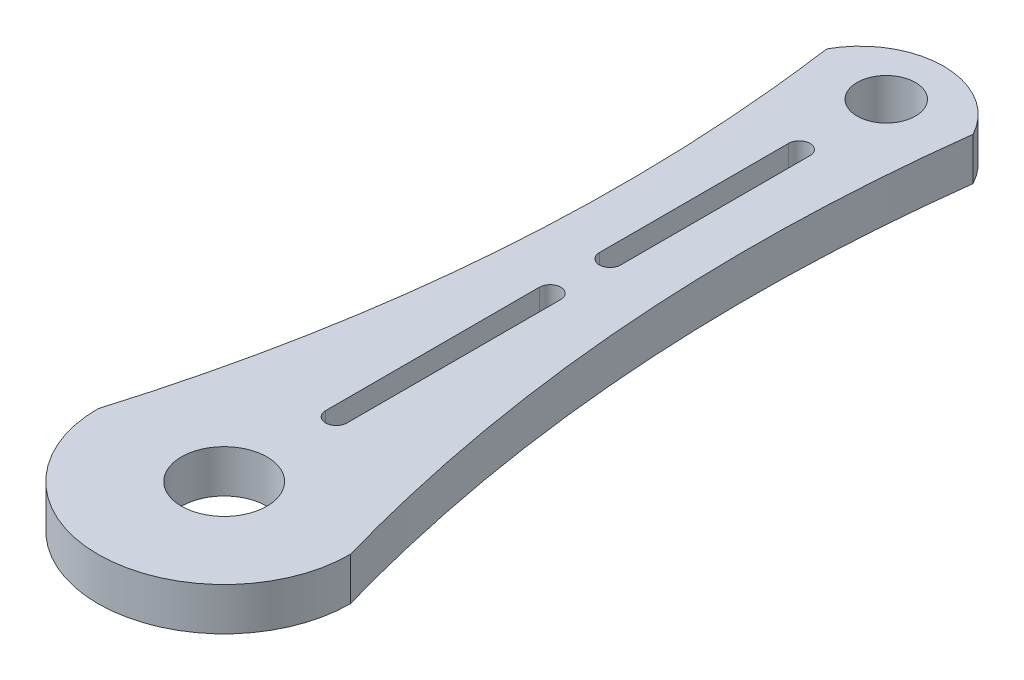
ISO-10303-21;
HEADER;
FILE_DESCRIPTION(('STEP AP214'),'2;1');
FILE_NAME('part.step','',(''),(''),'','','');
FILE_SCHEMA(('AUTOMOTIVE_DESIGN { 1 0 10303 214 1 1 1 1 }'));
ENDSEC;
DATA;
#1=APPLICATION_CONTEXT('core data for automotive mechanical design processes');
#2=APPLICATION_PROTOCOL_DEFINITION('international standard','automotive_design',2000,#1);
#3=PRODUCT_CONTEXT('',#1,'mechanical');
#4=PRODUCT('Part','Part','',(#3));
#5=PRODUCT_RELATED_PRODUCT_CATEGORY('part','',(#4));
#6=PRODUCT_DEFINITION_FORMATION('','',#4);
#7=PRODUCT_DEFINITION_CONTEXT('part definition',#1,'design');
#8=PRODUCT_DEFINITION('design','',#6,#7);
#9=PRODUCT_DEFINITION_SHAPE('','',#8);
#10=(LENGTH_UNIT() NAMED_UNIT(*) SI_UNIT(.MILLI.,.METRE.));
#11=(NAMED_UNIT(*) PLANE_ANGLE_UNIT() SI_UNIT($,.RADIAN.));
#12=(NAMED_UNIT(*) SI_UNIT($,.STERADIAN.) SOLID_ANGLE_UNIT());
#13=UNCERTAINTY_MEASURE_WITH_UNIT(LENGTH_MEASURE(1.E-05),#10,'distance_accuracy_value','');
#14=(GEOMETRIC_REPRESENTATION_CONTEXT(3) GLOBAL_UNCERTAINTY_ASSIGNED_CONTEXT((#13)) GLOBAL_UNIT_ASSIGNED_CONTEXT((#10,
#11,#12)) REPRESENTATION_CONTEXT('',''));
#15=CARTESIAN_POINT('',(0.,0.,0.));
#16=DIRECTION('',(0.,0.,1.));
#17=DIRECTION('',(1.,0.,0.));
#18=AXIS2_PLACEMENT_3D('',#15,#16,#17);
#19=CARTESIAN_POINT('',(-0.0131866120266083,10.,-148.700879107468));
#20=DIRECTION('',(0.,-1.,0.));
#21=DIRECTION('',(0.,0.,-1.));
#22=AXIS2_PLACEMENT_3D('',#19,#20,#21);
#23=CYLINDRICAL_SURFACE('',#22,19.5300694087633);
#24=CARTESIAN_POINT('',(-0.0131866120266083,0.,-148.700879107468));
#25=DIRECTION('',(0.,1.,0.));
#26=DIRECTION('',(0.,0.,-1.));
#27=AXIS2_PLACEMENT_3D('',#24,#25,#26);
#28=CIRCLE('',#27,19.5300694087633);
#29=CARTESIAN_POINT('',(17.2259140794981,0.,-157.878951805948));
#30=VERTEX_POINT('',#29);
#31=CARTESIAN_POINT('',(-17.1597094078173,0.,-158.050765049261));
#32=VERTEX_POINT('',#31);
#33=EDGE_CURVE('E244',#30,#32,#28,.T.);
#34=ORIENTED_EDGE('',*,*,#33,.T.);
#35=DIRECTION('',(0.,1.,0.));
#36=VECTOR('',#35,1.);
#37=CARTESIAN_POINT('',(-17.1597094078173,0.,-158.050765049262));
#38=LINE('',#37,#36);
#39=CARTESIAN_POINT('',(-17.1597094078173,10.,-158.050765049262));
#40=VERTEX_POINT('',#39);
#41=EDGE_CURVE('E241',#32,#40,#38,.T.);
#42=ORIENTED_EDGE('',*,*,#41,.T.);
#43=CARTESIAN_POINT('',(-0.0131866120266083,10.,-148.700879107468));
#44=DIRECTION('',(0.,1.,0.));
#45=DIRECTION('',(0.,0.,-1.));
#46=AXIS2_PLACEMENT_3D('',#43,#44,#45);
#47=CIRCLE('',#46,19.5300694087633);
#48=CARTESIAN_POINT('',(17.2259140794981,10.,-157.878951805948));
#49=VERTEX_POINT('',#48);
#50=EDGE_CURVE('E245',#49,#40,#47,.T.);
#51=ORIENTED_EDGE('',*,*,#50,.F.);
#52=DIRECTION('',(0.,1.,0.));
#53=VECTOR('',#52,1.);
#54=CARTESIAN_POINT('',(17.2259140794981,0.,-157.878951805948));
#55=LINE('',#54,#53);
#56=EDGE_CURVE('E206',#49,#30,#55,.F.);
#57=ORIENTED_EDGE('',*,*,#56,.T.);
#58=EDGE_LOOP('',(#34,#42,#51,#57));
#59=FACE_BOUND('',#58,.T.);
#60=ADVANCED_FACE('F37',(#59),#23,.T.);
#61=CARTESIAN_POINT('',(0.,10.,0.));
#62=DIRECTION('',(0.,-1.,0.));
#63=DIRECTION('',(0.,0.,-1.));
#64=AXIS2_PLACEMENT_3D('',#61,#62,#63);
#65=CYLINDRICAL_SURFACE('',#64,29.5);
#66=CARTESIAN_POINT('',(0.,0.,0.));
#67=DIRECTION('',(0.,1.,0.));
#68=DIRECTION('',(0.,0.,1.));
#69=AXIS2_PLACEMENT_3D('',#66,#67,#68);
#70=CIRCLE('',#69,29.5);
#71=CARTESIAN_POINT('',(-29.5,0.,0.));
#72=VERTEX_POINT('',#71);
#73=CARTESIAN_POINT('',(29.5,0.,0.));
#74=VERTEX_POINT('',#73);
#75=EDGE_CURVE('E249',#72,#74,#70,.T.);
#76=ORIENTED_EDGE('',*,*,#75,.T.);
#77=DIRECTION('',(0.,-1.,0.));
#78=VECTOR('',#77,1.);
#79=CARTESIAN_POINT('',(29.5,10.,0.));
#80=LINE('',#79,#78);
#81=CARTESIAN_POINT('',(29.5,10.,0.));
#82=VERTEX_POINT('',#81);
#83=EDGE_CURVE('E252',#82,#74,#80,.T.);
#84=ORIENTED_EDGE('',*,*,#83,.F.);
#85=CARTESIAN_POINT('',(0.,10.,0.));
#86=DIRECTION('',(0.,1.,0.));
#87=DIRECTION('',(0.,0.,1.));
#88=AXIS2_PLACEMENT_3D('',#85,#86,#87);
#89=CIRCLE('',#88,29.5);
#90=CARTESIAN_POINT('',(-29.5,10.,0.));
#91=VERTEX_POINT('',#90);
#92=EDGE_CURVE('E248',#91,#82,#89,.T.);
#93=ORIENTED_EDGE('',*,*,#92,.F.);
#94=DIRECTION('',(0.,-1.,0.));
#95=VECTOR('',#94,1.);
#96=CARTESIAN_POINT('',(-29.5,10.,0.));
#97=LINE('',#96,#95);
#98=EDGE_CURVE('E46',#91,#72,#97,.T.);
#99=ORIENTED_EDGE('',*,*,#98,.T.);
#100=EDGE_LOOP('',(#76,#84,#93,#99));
#101=FACE_BOUND('',#100,.T.);
#102=ADVANCED_FACE('F261',(#101),#65,.T.);
#103=CARTESIAN_POINT('',(-0.0131866120266083,10.,-148.700879107468));
#104=DIRECTION('',(0.,-1.,0.));
#105=DIRECTION('',(0.,0.,-1.));
#106=AXIS2_PLACEMENT_3D('',#103,#104,#105);
#107=PLANE('',#106);
#108=CARTESIAN_POINT('',(0.,10.,0.));
#109=DIRECTION('',(0.,1.,0.));
#110=DIRECTION('',(0.,0.,1.));
#111=AXIS2_PLACEMENT_3D('',#108,#109,#110);
#112=CIRCLE('',#111,10.);
#113=CARTESIAN_POINT('',(0.,10.,10.));
#114=VERTEX_POINT('',#113);
#115=EDGE_CURVE('E443',#114,#114,#112,.T.);
#116=ORIENTED_EDGE('',*,*,#115,.F.);
#117=EDGE_LOOP('',(#116));
#118=FACE_BOUND('',#117,.T.);
#119=CARTESIAN_POINT('',(0.,10.,-154.809118852895));
#120=DIRECTION('',(0.,1.,0.));
#121=DIRECTION('',(0.,0.,1.));
#122=AXIS2_PLACEMENT_3D('',#119,#120,#121);
#123=CIRCLE('',#122,6.82292471130221);
#124=CARTESIAN_POINT('',(0.,10.,-147.986194141593));
#125=VERTEX_POINT('',#124);
#126=EDGE_CURVE('E153',#125,#125,#123,.T.);
#127=ORIENTED_EDGE('',*,*,#126,.F.);
#128=EDGE_LOOP('',(#127));
#129=FACE_BOUND('',#128,.T.);
#130=DIRECTION('',(0.,0.,-1.));
#131=VECTOR('',#130,1.);
#132=CARTESIAN_POINT('',(2.5,10.,-90.2154220833377));
#133=LINE('',#132,#131);
#134=CARTESIAN_POINT('',(2.5,10.,-90.2154220833377));
#135=VERTEX_POINT('',#134);
#136=CARTESIAN_POINT('',(2.5,10.,-134.474861861719));
#137=VERTEX_POINT('',#136);
#138=EDGE_CURVE('E159',#135,#137,#133,.T.);
#139=ORIENTED_EDGE('',*,*,#138,.F.);
#140=CARTESIAN_POINT('',(0.,10.,-90.2154220833377));
#141=DIRECTION('',(0.,1.,0.));
#142=DIRECTION('',(0.,0.,1.));
#143=AXIS2_PLACEMENT_3D('',#140,#141,#142);
#144=CIRCLE('',#143,2.5);
#145=CARTESIAN_POINT('',(-2.5,10.,-90.2154220833377));
#146=VERTEX_POINT('',#145);
#147=EDGE_CURVE('E53',#146,#135,#144,.T.);
#148=ORIENTED_EDGE('',*,*,#147,.F.);
#149=DIRECTION('',(0.,0.,1.));
#150=VECTOR('',#149,1.);
#151=CARTESIAN_POINT('',(-2.5,10.,-90.2154220833377));
#152=LINE('',#151,#150);
#153=CARTESIAN_POINT('',(-2.5,10.,-134.474861861719));
#154=VERTEX_POINT('',#153);
#155=EDGE_CURVE('E147',#154,#146,#152,.T.);
#156=ORIENTED_EDGE('',*,*,#155,.F.);
#157=CARTESIAN_POINT('',(0.,10.,-134.474861861719));
#158=DIRECTION('',(0.,1.,0.));
#159=DIRECTION('',(0.,0.,1.));
#160=AXIS2_PLACEMENT_3D('',#157,#158,#159);
#161=CIRCLE('',#160,2.5);
#162=EDGE_CURVE('E150',#137,#154,#161,.T.);
#163=ORIENTED_EDGE('',*,*,#162,.F.);
#164=EDGE_LOOP('',(#139,#148,#156,#163));
#165=FACE_BOUND('',#164,.T.);
#166=DIRECTION('',(0.,0.,1.));
#167=VECTOR('',#166,1.);
#168=CARTESIAN_POINT('',(-2.5,10.,-76.2052397074471));
#169=LINE('',#168,#167);
#170=CARTESIAN_POINT('',(-2.5,10.,-76.2052397074471));
#171=VERTEX_POINT('',#170);
#172=CARTESIAN_POINT('',(-2.5,10.,-26.2143616843828));
#173=VERTEX_POINT('',#172);
#174=EDGE_CURVE('E186',#171,#173,#169,.T.);
#175=ORIENTED_EDGE('',*,*,#174,.F.);
#176=CARTESIAN_POINT('',(0.,10.,-76.2052397074471));
#177=DIRECTION('',(0.,1.,0.));
#178=DIRECTION('',(0.,0.,1.));
#179=AXIS2_PLACEMENT_3D('',#176,#177,#178);
#180=CIRCLE('',#179,2.5);
#181=CARTESIAN_POINT('',(2.5,10.,-76.2052397074471));
#182=VERTEX_POINT('',#181);
#183=EDGE_CURVE('E61',#182,#171,#180,.T.);
#184=ORIENTED_EDGE('',*,*,#183,.F.);
#185=DIRECTION('',(0.,0.,-1.));
#186=VECTOR('',#185,1.);
#187=CARTESIAN_POINT('',(2.5,10.,-76.2052397074471));
#188=LINE('',#187,#186);
#189=CARTESIAN_POINT('',(2.50000000000001,10.,-26.2143616843828));
#190=VERTEX_POINT('',#189);
#191=EDGE_CURVE('E179',#190,#182,#188,.T.);
#192=ORIENTED_EDGE('',*,*,#191,.F.);
#193=CARTESIAN_POINT('',(0.,10.,-26.2143616843828));
#194=DIRECTION('',(0.,1.,0.));
#195=DIRECTION('',(0.,0.,1.));
#196=AXIS2_PLACEMENT_3D('',#193,#194,#195);
#197=CIRCLE('',#196,2.5);
#198=EDGE_CURVE('E182',#173,#190,#197,.T.);
#199=ORIENTED_EDGE('',*,*,#198,.F.);
#200=EDGE_LOOP('',(#175,#184,#192,#199));
#201=FACE_BOUND('',#200,.T.);
#202=ORIENTED_EDGE('',*,*,#50,.T.);
#203=CARTESIAN_POINT('',(-29.5,10.,0.));
#204=CARTESIAN_POINT('',(-4.8876426036966,10.,-82.1233802622793));
#205=CARTESIAN_POINT('',(-18.4064980313875,10.,-166.402529529188));
#206=B_SPLINE_CURVE_WITH_KNOTS('',2,(#203,#204,#205),.UNSPECIFIED.,.F.,.F.,(3,3),(0.,1.),.UNSPECIFIED.);
#207=EDGE_CURVE('E207',#91,#40,#206,.T.);
#208=ORIENTED_EDGE('',*,*,#207,.F.);
#209=ORIENTED_EDGE('',*,*,#92,.T.);
#210=CARTESIAN_POINT('',(18.3773929107141,10.,-166.400260194452));
#211=CARTESIAN_POINT('',(6.10031657084069,10.,-82.1762879712989));
#212=CARTESIAN_POINT('',(29.5,10.,0.));
#213=B_SPLINE_CURVE_WITH_KNOTS('',2,(#210,#211,#212),.UNSPECIFIED.,.F.,.F.,(3,3),(0.,1.),.UNSPECIFIED.);
#214=EDGE_CURVE('E165',#49,#82,#213,.T.);
#215=ORIENTED_EDGE('',*,*,#214,.F.);
#216=EDGE_LOOP('',(#202,#208,#209,#215));
#217=FACE_BOUND('',#216,.T.);
#218=ADVANCED_FACE('F228',(#118,#129,#165,#201,#217),#107,.F.);
#219=CARTESIAN_POINT('',(-0.0131866120266083,0.,-148.700879107468));
#220=DIRECTION('',(0.,-1.,0.));
#221=DIRECTION('',(0.,0.,-1.));
#222=AXIS2_PLACEMENT_3D('',#219,#220,#221);
#223=PLANE('',#222);
#224=CARTESIAN_POINT('',(0.,0.,0.));
#225=DIRECTION('',(0.,1.,0.));
#226=DIRECTION('',(0.,0.,1.));
#227=AXIS2_PLACEMENT_3D('',#224,#225,#226);
#228=CIRCLE('',#227,10.);
#229=CARTESIAN_POINT('',(0.,0.,10.));
#230=VERTEX_POINT('',#229);
#231=EDGE_CURVE('E441',#230,#230,#228,.T.);
#232=ORIENTED_EDGE('',*,*,#231,.T.);
#233=EDGE_LOOP('',(#232));
#234=FACE_BOUND('',#233,.T.);
#235=CARTESIAN_POINT('',(0.,0.,-154.809118852895));
#236=DIRECTION('',(0.,1.,0.));
#237=DIRECTION('',(0.,0.,1.));
#238=AXIS2_PLACEMENT_3D('',#235,#236,#237);
#239=CIRCLE('',#238,6.82292471130221);
#240=CARTESIAN_POINT('',(0.,0.,-147.986194141593));
#241=VERTEX_POINT('',#240);
#242=EDGE_CURVE('E178',#241,#241,#239,.T.);
#243=ORIENTED_EDGE('',*,*,#242,.T.);
#244=EDGE_LOOP('',(#243));
#245=FACE_BOUND('',#244,.T.);
#246=CARTESIAN_POINT('',(0.,0.,-90.2154220833377));
#247=DIRECTION('',(0.,1.,0.));
#248=DIRECTION('',(0.,0.,1.));
#249=AXIS2_PLACEMENT_3D('',#246,#247,#248);
#250=CIRCLE('',#249,2.5);
#251=CARTESIAN_POINT('',(-2.5,0.,-90.2154220833377));
#252=VERTEX_POINT('',#251);
#253=CARTESIAN_POINT('',(2.5,0.,-90.2154220833377));
#254=VERTEX_POINT('',#253);
#255=EDGE_CURVE('E128',#252,#254,#250,.T.);
#256=ORIENTED_EDGE('',*,*,#255,.T.);
#257=DIRECTION('',(0.,0.,-1.));
#258=VECTOR('',#257,1.);
#259=CARTESIAN_POINT('',(2.5,0.,-90.2154220833377));
#260=LINE('',#259,#258);
#261=CARTESIAN_POINT('',(2.5,0.,-134.474861861719));
#262=VERTEX_POINT('',#261);
#263=EDGE_CURVE('E138',#254,#262,#260,.T.);
#264=ORIENTED_EDGE('',*,*,#263,.T.);
#265=CARTESIAN_POINT('',(0.,0.,-134.474861861719));
#266=DIRECTION('',(0.,1.,0.));
#267=DIRECTION('',(0.,0.,1.));
#268=AXIS2_PLACEMENT_3D('',#265,#266,#267);
#269=CIRCLE('',#268,2.5);
#270=CARTESIAN_POINT('',(-2.5,0.,-134.474861861719));
#271=VERTEX_POINT('',#270);
#272=EDGE_CURVE('E142',#262,#271,#269,.T.);
#273=ORIENTED_EDGE('',*,*,#272,.T.);
#274=DIRECTION('',(0.,0.,1.));
#275=VECTOR('',#274,1.);
#276=CARTESIAN_POINT('',(-2.5,0.,-90.2154220833377));
#277=LINE('',#276,#275);
#278=EDGE_CURVE('E134',#271,#252,#277,.T.);
#279=ORIENTED_EDGE('',*,*,#278,.T.);
#280=EDGE_LOOP('',(#256,#264,#273,#279));
#281=FACE_BOUND('',#280,.T.);
#282=CARTESIAN_POINT('',(0.,0.,-76.2052397074471));
#283=DIRECTION('',(0.,1.,0.));
#284=DIRECTION('',(0.,0.,1.));
#285=AXIS2_PLACEMENT_3D('',#282,#283,#284);
#286=CIRCLE('',#285,2.5);
#287=CARTESIAN_POINT('',(2.5,0.,-76.2052397074471));
#288=VERTEX_POINT('',#287);
#289=CARTESIAN_POINT('',(-2.5,0.,-76.2052397074471));
#290=VERTEX_POINT('',#289);
#291=EDGE_CURVE('E183',#288,#290,#286,.T.);
#292=ORIENTED_EDGE('',*,*,#291,.T.);
#293=DIRECTION('',(0.,0.,1.));
#294=VECTOR('',#293,1.);
#295=CARTESIAN_POINT('',(-2.5,0.,-76.2052397074471));
#296=LINE('',#295,#294);
#297=CARTESIAN_POINT('',(-2.49999999999999,0.,-26.2143616843828));
#298=VERTEX_POINT('',#297);
#299=EDGE_CURVE('E195',#290,#298,#296,.T.);
#300=ORIENTED_EDGE('',*,*,#299,.T.);
#301=CARTESIAN_POINT('',(0.,0.,-26.2143616843828));
#302=DIRECTION('',(0.,1.,0.));
#303=DIRECTION('',(0.,0.,1.));
#304=AXIS2_PLACEMENT_3D('',#301,#302,#303);
#305=CIRCLE('',#304,2.5);
#306=CARTESIAN_POINT('',(2.50000000000001,0.,-26.2143616843828));
#307=VERTEX_POINT('',#306);
#308=EDGE_CURVE('E192',#298,#307,#305,.T.);
#309=ORIENTED_EDGE('',*,*,#308,.T.);
#310=DIRECTION('',(0.,0.,-1.));
#311=VECTOR('',#310,1.);
#312=CARTESIAN_POINT('',(2.5,0.,-76.2052397074471));
#313=LINE('',#312,#311);
#314=EDGE_CURVE('E171',#307,#288,#313,.T.);
#315=ORIENTED_EDGE('',*,*,#314,.T.);
#316=EDGE_LOOP('',(#292,#300,#309,#315));
#317=FACE_BOUND('',#316,.T.);
#318=CARTESIAN_POINT('',(-29.5,0.,0.));
#319=CARTESIAN_POINT('',(-4.8876426036966,0.,-82.1233802622793));
#320=CARTESIAN_POINT('',(-18.4064980313875,0.,-166.402529529188));
#321=B_SPLINE_CURVE_WITH_KNOTS('',2,(#318,#319,#320),.UNSPECIFIED.,.F.,.F.,(3,3),(0.,1.),.UNSPECIFIED.);
#322=EDGE_CURVE('E200',#72,#32,#321,.T.);
#323=ORIENTED_EDGE('',*,*,#322,.T.);
#324=ORIENTED_EDGE('',*,*,#33,.F.);
#325=CARTESIAN_POINT('',(18.3773929107141,0.,-166.400260194452));
#326=CARTESIAN_POINT('',(6.10031657084069,0.,-82.1762879712989));
#327=CARTESIAN_POINT('',(29.5,0.,0.));
#328=B_SPLINE_CURVE_WITH_KNOTS('',2,(#325,#326,#327),.UNSPECIFIED.,.F.,.F.,(3,3),(0.,1.),.UNSPECIFIED.);
#329=EDGE_CURVE('E11',#74,#30,#328,.F.);
#330=ORIENTED_EDGE('',*,*,#329,.F.);
#331=ORIENTED_EDGE('',*,*,#75,.F.);
#332=EDGE_LOOP('',(#323,#324,#330,#331));
#333=FACE_BOUND('',#332,.T.);
#334=ADVANCED_FACE('F144',(#234,#245,#281,#317,#333),#223,.T.);
#335=CARTESIAN_POINT('',(18.3773929107141,0.,-166.400260194452));
#336=CARTESIAN_POINT('',(6.10031657084069,0.,-82.1762879712989));
#337=CARTESIAN_POINT('',(29.5,0.,0.));
#338=B_SPLINE_CURVE_WITH_KNOTS('',2,(#335,#336,#337),.UNSPECIFIED.,.F.,.F.,(3,3),(0.,1.),.UNSPECIFIED.);
#339=DIRECTION('',(0.,1.,0.));
#340=VECTOR('',#339,1.);
#341=SURFACE_OF_LINEAR_EXTRUSION('',#338,#340);
#342=ORIENTED_EDGE('',*,*,#214,.T.);
#343=ORIENTED_EDGE('',*,*,#83,.T.);
#344=ORIENTED_EDGE('',*,*,#329,.T.);
#345=ORIENTED_EDGE('',*,*,#56,.F.);
#346=EDGE_LOOP('',(#342,#343,#344,#345));
#347=FACE_BOUND('',#346,.T.);
#348=ADVANCED_FACE('F220',(#347),#341,.F.);
#349=DIRECTION('',(0.,1.,0.));
#350=VECTOR('',#349,1.);
#351=SURFACE_OF_LINEAR_EXTRUSION('',#321,#350);
#352=ORIENTED_EDGE('',*,*,#322,.F.);
#353=ORIENTED_EDGE('',*,*,#98,.F.);
#354=ORIENTED_EDGE('',*,*,#207,.T.);
#355=ORIENTED_EDGE('',*,*,#41,.F.);
#356=EDGE_LOOP('',(#352,#353,#354,#355));
#357=FACE_BOUND('',#356,.T.);
#358=ADVANCED_FACE('F215',(#357),#351,.F.);
#359=CARTESIAN_POINT('',(0.,0.,-76.2052397074471));
#360=DIRECTION('',(0.,1.,0.));
#361=DIRECTION('',(0.,0.,1.));
#362=AXIS2_PLACEMENT_3D('',#359,#360,#361);
#363=CYLINDRICAL_SURFACE('',#362,2.5);
#364=ORIENTED_EDGE('',*,*,#183,.T.);
#365=DIRECTION('',(0.,1.,0.));
#366=VECTOR('',#365,1.);
#367=CARTESIAN_POINT('',(-2.5,0.,-76.2052397074471));
#368=LINE('',#367,#366);
#369=EDGE_CURVE('E169',#290,#171,#368,.T.);
#370=ORIENTED_EDGE('',*,*,#369,.F.);
#371=ORIENTED_EDGE('',*,*,#291,.F.);
#372=DIRECTION('',(0.,1.,0.));
#373=VECTOR('',#372,1.);
#374=CARTESIAN_POINT('',(2.5,0.,-76.2052397074471));
#375=LINE('',#374,#373);
#376=EDGE_CURVE('E176',#288,#182,#375,.T.);
#377=ORIENTED_EDGE('',*,*,#376,.T.);
#378=EDGE_LOOP('',(#364,#370,#371,#377));
#379=FACE_BOUND('',#378,.T.);
#380=ADVANCED_FACE('F219',(#379),#363,.F.);
#381=CARTESIAN_POINT('',(2.5,0.,-76.2052397074471));
#382=DIRECTION('',(1.,0.,0.));
#383=DIRECTION('',(0.,0.,-1.));
#384=AXIS2_PLACEMENT_3D('',#381,#382,#383);
#385=PLANE('',#384);
#386=ORIENTED_EDGE('',*,*,#191,.T.);
#387=ORIENTED_EDGE('',*,*,#376,.F.);
#388=ORIENTED_EDGE('',*,*,#314,.F.);
#389=DIRECTION('',(0.,1.,0.));
#390=VECTOR('',#389,1.);
#391=CARTESIAN_POINT('',(2.50000000000001,0.,-26.2143616843828));
#392=LINE('',#391,#390);
#393=EDGE_CURVE('E174',#307,#190,#392,.T.);
#394=ORIENTED_EDGE('',*,*,#393,.T.);
#395=EDGE_LOOP('',(#386,#387,#388,#394));
#396=FACE_BOUND('',#395,.T.);
#397=ADVANCED_FACE('F222',(#396),#385,.F.);
#398=CARTESIAN_POINT('',(0.,0.,-26.2143616843828));
#399=DIRECTION('',(0.,1.,0.));
#400=DIRECTION('',(0.,0.,1.));
#401=AXIS2_PLACEMENT_3D('',#398,#399,#400);
#402=CYLINDRICAL_SURFACE('',#401,2.5);
#403=ORIENTED_EDGE('',*,*,#198,.T.);
#404=ORIENTED_EDGE('',*,*,#393,.F.);
#405=ORIENTED_EDGE('',*,*,#308,.F.);
#406=DIRECTION('',(0.,1.,0.));
#407=VECTOR('',#406,1.);
#408=CARTESIAN_POINT('',(-2.5,0.,-26.2143616843828));
#409=LINE('',#408,#407);
#410=EDGE_CURVE('E172',#298,#173,#409,.T.);
#411=ORIENTED_EDGE('',*,*,#410,.T.);
#412=EDGE_LOOP('',(#403,#404,#405,#411));
#413=FACE_BOUND('',#412,.T.);
#414=ADVANCED_FACE('F322',(#413),#402,.F.);
#415=CARTESIAN_POINT('',(-2.5,0.,-76.2052397074471));
#416=DIRECTION('',(-1.,0.,0.));
#417=DIRECTION('',(0.,0.,1.));
#418=AXIS2_PLACEMENT_3D('',#415,#416,#417);
#419=PLANE('',#418);
#420=ORIENTED_EDGE('',*,*,#174,.T.);
#421=ORIENTED_EDGE('',*,*,#410,.F.);
#422=ORIENTED_EDGE('',*,*,#299,.F.);
#423=ORIENTED_EDGE('',*,*,#369,.T.);
#424=EDGE_LOOP('',(#420,#421,#422,#423));
#425=FACE_BOUND('',#424,.T.);
#426=ADVANCED_FACE('F332',(#425),#419,.F.);
#427=CARTESIAN_POINT('',(0.,0.,-90.2154220833377));
#428=DIRECTION('',(0.,1.,0.));
#429=DIRECTION('',(0.,0.,1.));
#430=AXIS2_PLACEMENT_3D('',#427,#428,#429);
#431=CYLINDRICAL_SURFACE('',#430,2.5);
#432=ORIENTED_EDGE('',*,*,#147,.T.);
#433=DIRECTION('',(0.,1.,0.));
#434=VECTOR('',#433,1.);
#435=CARTESIAN_POINT('',(2.5,0.,-90.2154220833377));
#436=LINE('',#435,#434);
#437=EDGE_CURVE('E124',#254,#135,#436,.T.);
#438=ORIENTED_EDGE('',*,*,#437,.F.);
#439=ORIENTED_EDGE('',*,*,#255,.F.);
#440=DIRECTION('',(0.,1.,0.));
#441=VECTOR('',#440,1.);
#442=CARTESIAN_POINT('',(-2.5,0.,-90.2154220833377));
#443=LINE('',#442,#441);
#444=EDGE_CURVE('E163',#252,#146,#443,.T.);
#445=ORIENTED_EDGE('',*,*,#444,.T.);
#446=EDGE_LOOP('',(#432,#438,#439,#445));
#447=FACE_BOUND('',#446,.T.);
#448=ADVANCED_FACE('F126',(#447),#431,.F.);
#449=CARTESIAN_POINT('',(-2.5,0.,-90.2154220833377));
#450=DIRECTION('',(-1.,0.,0.));
#451=DIRECTION('',(0.,0.,1.));
#452=AXIS2_PLACEMENT_3D('',#449,#450,#451);
#453=PLANE('',#452);
#454=ORIENTED_EDGE('',*,*,#155,.T.);
#455=ORIENTED_EDGE('',*,*,#444,.F.);
#456=ORIENTED_EDGE('',*,*,#278,.F.);
#457=DIRECTION('',(0.,1.,0.));
#458=VECTOR('',#457,1.);
#459=CARTESIAN_POINT('',(-2.5,0.,-134.474861861719));
#460=LINE('',#459,#458);
#461=EDGE_CURVE('E166',#271,#154,#460,.T.);
#462=ORIENTED_EDGE('',*,*,#461,.T.);
#463=EDGE_LOOP('',(#454,#455,#456,#462));
#464=FACE_BOUND('',#463,.T.);
#465=ADVANCED_FACE('F352',(#464),#453,.F.);
#466=CARTESIAN_POINT('',(0.,0.,-134.474861861719));
#467=DIRECTION('',(0.,1.,0.));
#468=DIRECTION('',(0.,0.,1.));
#469=AXIS2_PLACEMENT_3D('',#466,#467,#468);
#470=CYLINDRICAL_SURFACE('',#469,2.5);
#471=ORIENTED_EDGE('',*,*,#162,.T.);
#472=ORIENTED_EDGE('',*,*,#461,.F.);
#473=ORIENTED_EDGE('',*,*,#272,.F.);
#474=DIRECTION('',(0.,1.,0.));
#475=VECTOR('',#474,1.);
#476=CARTESIAN_POINT('',(2.5,0.,-134.474861861719));
#477=LINE('',#476,#475);
#478=EDGE_CURVE('E133',#262,#137,#477,.T.);
#479=ORIENTED_EDGE('',*,*,#478,.T.);
#480=EDGE_LOOP('',(#471,#472,#473,#479));
#481=FACE_BOUND('',#480,.T.);
#482=ADVANCED_FACE('F362',(#481),#470,.F.);
#483=CARTESIAN_POINT('',(2.5,0.,-90.2154220833377));
#484=DIRECTION('',(1.,0.,0.));
#485=DIRECTION('',(0.,0.,-1.));
#486=AXIS2_PLACEMENT_3D('',#483,#484,#485);
#487=PLANE('',#486);
#488=ORIENTED_EDGE('',*,*,#138,.T.);
#489=ORIENTED_EDGE('',*,*,#478,.F.);
#490=ORIENTED_EDGE('',*,*,#263,.F.);
#491=ORIENTED_EDGE('',*,*,#437,.T.);
#492=EDGE_LOOP('',(#488,#489,#490,#491));
#493=FACE_BOUND('',#492,.T.);
#494=ADVANCED_FACE('F139',(#493),#487,.F.);
#495=CARTESIAN_POINT('',(0.,0.,-154.809118852895));
#496=DIRECTION('',(0.,1.,0.));
#497=DIRECTION('',(0.,0.,1.));
#498=AXIS2_PLACEMENT_3D('',#495,#496,#497);
#499=CYLINDRICAL_SURFACE('',#498,6.82292471130221);
#500=ORIENTED_EDGE('',*,*,#242,.F.);
#501=EDGE_LOOP('',(#500));
#502=FACE_BOUND('',#501,.T.);
#503=ORIENTED_EDGE('',*,*,#126,.T.);
#504=EDGE_LOOP('',(#503));
#505=FACE_BOUND('',#504,.T.);
#506=ADVANCED_FACE('F383',(#502,#505),#499,.F.);
#507=CARTESIAN_POINT('',(0.,0.,0.));
#508=DIRECTION('',(0.,1.,0.));
#509=DIRECTION('',(0.,0.,1.));
#510=AXIS2_PLACEMENT_3D('',#507,#508,#509);
#511=CYLINDRICAL_SURFACE('',#510,10.);
#512=ORIENTED_EDGE('',*,*,#231,.F.);
#513=EDGE_LOOP('',(#512));
#514=FACE_BOUND('',#513,.T.);
#515=ORIENTED_EDGE('',*,*,#115,.T.);
#516=EDGE_LOOP('',(#515));
#517=FACE_BOUND('',#516,.T.);
#518=ADVANCED_FACE('F392',(#514,#517),#511,.F.);
#519=CLOSED_SHELL('',(#60,#102,#218,#334,#348,#358,#380,#397,#414,#426,#448,#465,#482,#494,#506,#518));
#520=MANIFOLD_SOLID_BREP('B2',#519);
#521=ADVANCED_BREP_SHAPE_REPRESENTATION('',(#18,#520),#14);
#522=SHAPE_DEFINITION_REPRESENTATION(#9,#521);
ENDSEC;
END-ISO-10303-21;
